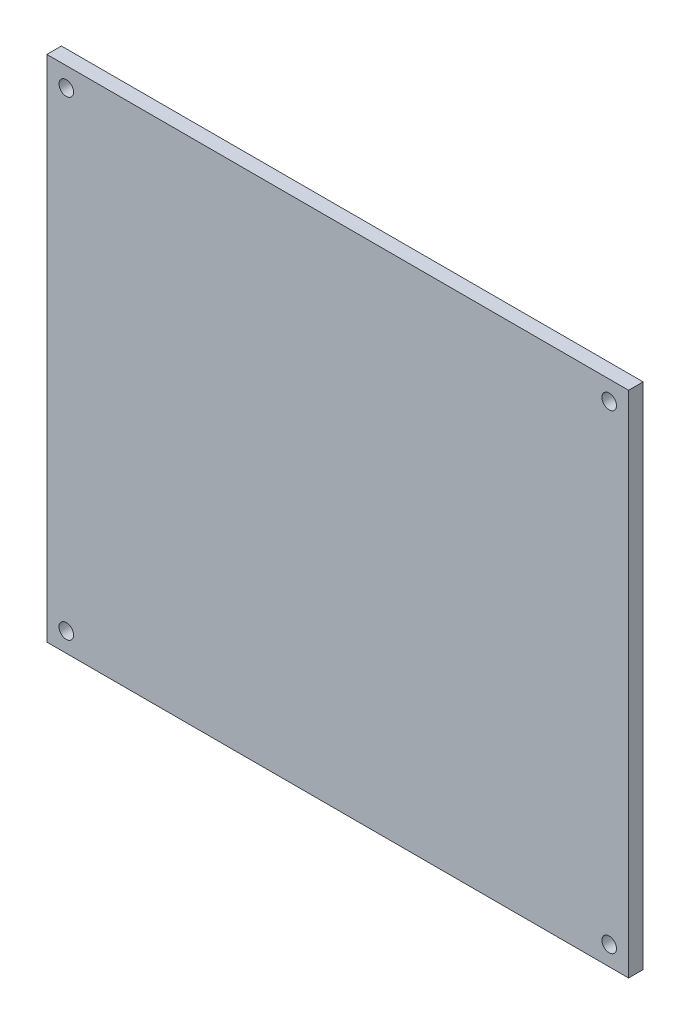
ISO-10303-21;
HEADER;
FILE_DESCRIPTION(('STEP AP214'),'2;1');
FILE_NAME('part.step','',(''),(''),'','','');
FILE_SCHEMA(('AUTOMOTIVE_DESIGN { 1 0 10303 214 1 1 1 1 }'));
ENDSEC;
DATA;
#1=APPLICATION_CONTEXT('core data for automotive mechanical design processes');
#2=APPLICATION_PROTOCOL_DEFINITION('international standard','automotive_design',2000,#1);
#3=PRODUCT_CONTEXT('',#1,'mechanical');
#4=PRODUCT('Part','Part','',(#3));
#5=PRODUCT_RELATED_PRODUCT_CATEGORY('part','',(#4));
#6=PRODUCT_DEFINITION_FORMATION('','',#4);
#7=PRODUCT_DEFINITION_CONTEXT('part definition',#1,'design');
#8=PRODUCT_DEFINITION('design','',#6,#7);
#9=PRODUCT_DEFINITION_SHAPE('','',#8);
#10=(LENGTH_UNIT() NAMED_UNIT(*) SI_UNIT(.MILLI.,.METRE.));
#11=(NAMED_UNIT(*) PLANE_ANGLE_UNIT() SI_UNIT($,.RADIAN.));
#12=(NAMED_UNIT(*) SI_UNIT($,.STERADIAN.) SOLID_ANGLE_UNIT());
#13=UNCERTAINTY_MEASURE_WITH_UNIT(LENGTH_MEASURE(1.E-05),#10,'distance_accuracy_value','');
#14=(GEOMETRIC_REPRESENTATION_CONTEXT(3) GLOBAL_UNCERTAINTY_ASSIGNED_CONTEXT((#13)) GLOBAL_UNIT_ASSIGNED_CONTEXT((#10,
#11,#12)) REPRESENTATION_CONTEXT('',''));
#15=CARTESIAN_POINT('',(0.,0.,0.));
#16=DIRECTION('',(0.,0.,1.));
#17=DIRECTION('',(1.,0.,0.));
#18=AXIS2_PLACEMENT_3D('',#15,#16,#17);
#19=CARTESIAN_POINT('',(60.,52.5,3.));
#20=DIRECTION('',(-1.,0.,0.));
#21=DIRECTION('',(0.,0.,1.));
#22=AXIS2_PLACEMENT_3D('',#19,#20,#21);
#23=PLANE('',#22);
#24=DIRECTION('',(0.,1.,0.));
#25=VECTOR('',#24,1.);
#26=CARTESIAN_POINT('',(60.,52.5,0.));
#27=LINE('',#26,#25);
#28=CARTESIAN_POINT('',(60.,-52.5,0.));
#29=VERTEX_POINT('',#28);
#30=CARTESIAN_POINT('',(60.,52.5,0.));
#31=VERTEX_POINT('',#30);
#32=EDGE_CURVE('E113',#29,#31,#27,.T.);
#33=ORIENTED_EDGE('',*,*,#32,.T.);
#34=DIRECTION('',(0.,0.,-1.));
#35=VECTOR('',#34,1.);
#36=CARTESIAN_POINT('',(60.,52.5,3.));
#37=LINE('',#36,#35);
#38=CARTESIAN_POINT('',(60.,52.5,3.));
#39=VERTEX_POINT('',#38);
#40=EDGE_CURVE('E11',#39,#31,#37,.T.);
#41=ORIENTED_EDGE('',*,*,#40,.F.);
#42=DIRECTION('',(0.,1.,0.));
#43=VECTOR('',#42,1.);
#44=CARTESIAN_POINT('',(60.,52.5,3.));
#45=LINE('',#44,#43);
#46=CARTESIAN_POINT('',(60.,-52.5,3.));
#47=VERTEX_POINT('',#46);
#48=EDGE_CURVE('E96',#47,#39,#45,.T.);
#49=ORIENTED_EDGE('',*,*,#48,.F.);
#50=DIRECTION('',(0.,0.,-1.));
#51=VECTOR('',#50,1.);
#52=CARTESIAN_POINT('',(60.,-52.5,3.));
#53=LINE('',#52,#51);
#54=EDGE_CURVE('E109',#47,#29,#53,.T.);
#55=ORIENTED_EDGE('',*,*,#54,.T.);
#56=EDGE_LOOP('',(#33,#41,#49,#55));
#57=FACE_BOUND('',#56,.T.);
#58=ADVANCED_FACE('F42',(#57),#23,.F.);
#59=CARTESIAN_POINT('',(-60.,52.5,3.));
#60=DIRECTION('',(0.,-1.,0.));
#61=DIRECTION('',(0.,0.,-1.));
#62=AXIS2_PLACEMENT_3D('',#59,#60,#61);
#63=PLANE('',#62);
#64=DIRECTION('',(-1.,0.,0.));
#65=VECTOR('',#64,1.);
#66=CARTESIAN_POINT('',(-60.,52.5,0.));
#67=LINE('',#66,#65);
#68=CARTESIAN_POINT('',(-60.,52.5,0.));
#69=VERTEX_POINT('',#68);
#70=EDGE_CURVE('E101',#31,#69,#67,.T.);
#71=ORIENTED_EDGE('',*,*,#70,.T.);
#72=DIRECTION('',(0.,0.,-1.));
#73=VECTOR('',#72,1.);
#74=CARTESIAN_POINT('',(-60.,52.5,3.));
#75=LINE('',#74,#73);
#76=CARTESIAN_POINT('',(-60.,52.5,3.));
#77=VERTEX_POINT('',#76);
#78=EDGE_CURVE('E52',#77,#69,#75,.T.);
#79=ORIENTED_EDGE('',*,*,#78,.F.);
#80=DIRECTION('',(-1.,0.,0.));
#81=VECTOR('',#80,1.);
#82=CARTESIAN_POINT('',(-60.,52.5,3.));
#83=LINE('',#82,#81);
#84=EDGE_CURVE('E91',#39,#77,#83,.T.);
#85=ORIENTED_EDGE('',*,*,#84,.F.);
#86=ORIENTED_EDGE('',*,*,#40,.T.);
#87=EDGE_LOOP('',(#71,#79,#85,#86));
#88=FACE_BOUND('',#87,.T.);
#89=ADVANCED_FACE('F100',(#88),#63,.F.);
#90=CARTESIAN_POINT('',(-60.,52.5,3.));
#91=DIRECTION('',(1.,0.,0.));
#92=DIRECTION('',(0.,0.,-1.));
#93=AXIS2_PLACEMENT_3D('',#90,#91,#92);
#94=PLANE('',#93);
#95=DIRECTION('',(0.,-1.,0.));
#96=VECTOR('',#95,1.);
#97=CARTESIAN_POINT('',(-60.,52.5,0.));
#98=LINE('',#97,#96);
#99=CARTESIAN_POINT('',(-60.,-52.5,0.));
#100=VERTEX_POINT('',#99);
#101=EDGE_CURVE('E78',#69,#100,#98,.T.);
#102=ORIENTED_EDGE('',*,*,#101,.T.);
#103=DIRECTION('',(0.,0.,-1.));
#104=VECTOR('',#103,1.);
#105=CARTESIAN_POINT('',(-60.,-52.5,3.));
#106=LINE('',#105,#104);
#107=CARTESIAN_POINT('',(-60.,-52.5,3.));
#108=VERTEX_POINT('',#107);
#109=EDGE_CURVE('E103',#108,#100,#106,.T.);
#110=ORIENTED_EDGE('',*,*,#109,.F.);
#111=DIRECTION('',(0.,-1.,0.));
#112=VECTOR('',#111,1.);
#113=CARTESIAN_POINT('',(-60.,52.5,3.));
#114=LINE('',#113,#112);
#115=EDGE_CURVE('E94',#77,#108,#114,.T.);
#116=ORIENTED_EDGE('',*,*,#115,.F.);
#117=ORIENTED_EDGE('',*,*,#78,.T.);
#118=EDGE_LOOP('',(#102,#110,#116,#117));
#119=FACE_BOUND('',#118,.T.);
#120=ADVANCED_FACE('F105',(#119),#94,.F.);
#121=CARTESIAN_POINT('',(-60.,-52.5,3.));
#122=DIRECTION('',(0.,1.,0.));
#123=DIRECTION('',(0.,0.,1.));
#124=AXIS2_PLACEMENT_3D('',#121,#122,#123);
#125=PLANE('',#124);
#126=DIRECTION('',(1.,0.,0.));
#127=VECTOR('',#126,1.);
#128=CARTESIAN_POINT('',(-60.,-52.5,0.));
#129=LINE('',#128,#127);
#130=EDGE_CURVE('E84',#100,#29,#129,.T.);
#131=ORIENTED_EDGE('',*,*,#130,.T.);
#132=ORIENTED_EDGE('',*,*,#54,.F.);
#133=DIRECTION('',(1.,0.,0.));
#134=VECTOR('',#133,1.);
#135=CARTESIAN_POINT('',(-60.,-52.5,3.));
#136=LINE('',#135,#134);
#137=EDGE_CURVE('E61',#108,#47,#136,.T.);
#138=ORIENTED_EDGE('',*,*,#137,.F.);
#139=ORIENTED_EDGE('',*,*,#109,.T.);
#140=EDGE_LOOP('',(#131,#132,#138,#139));
#141=FACE_BOUND('',#140,.T.);
#142=ADVANCED_FACE('F175',(#141),#125,.F.);
#143=CARTESIAN_POINT('',(0.,0.,3.));
#144=DIRECTION('',(0.,0.,1.));
#145=DIRECTION('',(1.,0.,0.));
#146=AXIS2_PLACEMENT_3D('',#143,#144,#145);
#147=PLANE('',#146);
#148=CARTESIAN_POINT('',(-56.,-48.5,3.));
#149=DIRECTION('',(0.,0.,1.));
#150=DIRECTION('',(-1.,0.,0.));
#151=AXIS2_PLACEMENT_3D('',#148,#149,#150);
#152=CIRCLE('',#151,1.5);
#153=CARTESIAN_POINT('',(-57.5,-48.5,3.));
#154=VERTEX_POINT('',#153);
#155=EDGE_CURVE('E276',#154,#154,#152,.T.);
#156=ORIENTED_EDGE('',*,*,#155,.F.);
#157=EDGE_LOOP('',(#156));
#158=FACE_BOUND('',#157,.T.);
#159=CARTESIAN_POINT('',(56.,-48.5,3.));
#160=DIRECTION('',(0.,0.,1.));
#161=DIRECTION('',(1.,0.,0.));
#162=AXIS2_PLACEMENT_3D('',#159,#160,#161);
#163=CIRCLE('',#162,1.49999999999999);
#164=CARTESIAN_POINT('',(57.5,-48.5,3.));
#165=VERTEX_POINT('',#164);
#166=EDGE_CURVE('E269',#165,#165,#163,.T.);
#167=ORIENTED_EDGE('',*,*,#166,.F.);
#168=EDGE_LOOP('',(#167));
#169=FACE_BOUND('',#168,.T.);
#170=CARTESIAN_POINT('',(56.,48.5,3.));
#171=DIRECTION('',(0.,0.,1.));
#172=DIRECTION('',(-1.,0.,0.));
#173=AXIS2_PLACEMENT_3D('',#170,#171,#172);
#174=CIRCLE('',#173,1.49999999999999);
#175=CARTESIAN_POINT('',(54.5,48.5,3.));
#176=VERTEX_POINT('',#175);
#177=EDGE_CURVE('E261',#176,#176,#174,.T.);
#178=ORIENTED_EDGE('',*,*,#177,.F.);
#179=EDGE_LOOP('',(#178));
#180=FACE_BOUND('',#179,.T.);
#181=CARTESIAN_POINT('',(-56.,48.5,3.));
#182=DIRECTION('',(0.,0.,1.));
#183=DIRECTION('',(1.,0.,0.));
#184=AXIS2_PLACEMENT_3D('',#181,#182,#183);
#185=CIRCLE('',#184,1.5);
#186=CARTESIAN_POINT('',(-54.5,48.5,3.));
#187=VERTEX_POINT('',#186);
#188=EDGE_CURVE('E132',#187,#187,#185,.T.);
#189=ORIENTED_EDGE('',*,*,#188,.F.);
#190=EDGE_LOOP('',(#189));
#191=FACE_BOUND('',#190,.T.);
#192=ORIENTED_EDGE('',*,*,#48,.T.);
#193=ORIENTED_EDGE('',*,*,#84,.T.);
#194=ORIENTED_EDGE('',*,*,#115,.T.);
#195=ORIENTED_EDGE('',*,*,#137,.T.);
#196=EDGE_LOOP('',(#192,#193,#194,#195));
#197=FACE_BOUND('',#196,.T.);
#198=ADVANCED_FACE('F92',(#158,#169,#180,#191,#197),#147,.T.);
#199=CARTESIAN_POINT('',(0.,0.,0.));
#200=DIRECTION('',(0.,0.,1.));
#201=DIRECTION('',(1.,0.,0.));
#202=AXIS2_PLACEMENT_3D('',#199,#200,#201);
#203=PLANE('',#202);
#204=CARTESIAN_POINT('',(-56.,-48.5,0.));
#205=DIRECTION('',(0.,0.,1.));
#206=DIRECTION('',(1.,0.,0.));
#207=AXIS2_PLACEMENT_3D('',#204,#205,#206);
#208=CIRCLE('',#207,1.5);
#209=CARTESIAN_POINT('',(-54.5,-48.5,0.));
#210=VERTEX_POINT('',#209);
#211=EDGE_CURVE('E45',#210,#210,#208,.T.);
#212=ORIENTED_EDGE('',*,*,#211,.T.);
#213=EDGE_LOOP('',(#212));
#214=FACE_BOUND('',#213,.T.);
#215=CARTESIAN_POINT('',(56.,-48.5,0.));
#216=DIRECTION('',(0.,0.,1.));
#217=DIRECTION('',(1.,0.,0.));
#218=AXIS2_PLACEMENT_3D('',#215,#216,#217);
#219=CIRCLE('',#218,1.49999999999999);
#220=CARTESIAN_POINT('',(57.5,-48.5,0.));
#221=VERTEX_POINT('',#220);
#222=EDGE_CURVE('E135',#221,#221,#219,.T.);
#223=ORIENTED_EDGE('',*,*,#222,.T.);
#224=EDGE_LOOP('',(#223));
#225=FACE_BOUND('',#224,.T.);
#226=CARTESIAN_POINT('',(56.,48.5,0.));
#227=DIRECTION('',(0.,0.,1.));
#228=DIRECTION('',(1.,0.,0.));
#229=AXIS2_PLACEMENT_3D('',#226,#227,#228);
#230=CIRCLE('',#229,1.49999999999999);
#231=CARTESIAN_POINT('',(57.5,48.5,0.));
#232=VERTEX_POINT('',#231);
#233=EDGE_CURVE('E131',#232,#232,#230,.T.);
#234=ORIENTED_EDGE('',*,*,#233,.T.);
#235=EDGE_LOOP('',(#234));
#236=FACE_BOUND('',#235,.T.);
#237=CARTESIAN_POINT('',(-56.,48.5,0.));
#238=DIRECTION('',(0.,0.,1.));
#239=DIRECTION('',(1.,0.,0.));
#240=AXIS2_PLACEMENT_3D('',#237,#238,#239);
#241=CIRCLE('',#240,1.5);
#242=CARTESIAN_POINT('',(-54.5,48.5,0.));
#243=VERTEX_POINT('',#242);
#244=EDGE_CURVE('E127',#243,#243,#241,.T.);
#245=ORIENTED_EDGE('',*,*,#244,.T.);
#246=EDGE_LOOP('',(#245));
#247=FACE_BOUND('',#246,.T.);
#248=ORIENTED_EDGE('',*,*,#32,.F.);
#249=ORIENTED_EDGE('',*,*,#130,.F.);
#250=ORIENTED_EDGE('',*,*,#101,.F.);
#251=ORIENTED_EDGE('',*,*,#70,.F.);
#252=EDGE_LOOP('',(#248,#249,#250,#251));
#253=FACE_BOUND('',#252,.T.);
#254=ADVANCED_FACE('F144',(#214,#225,#236,#247,#253),#203,.F.);
#255=CARTESIAN_POINT('',(-56.,48.5,-7.));
#256=DIRECTION('',(0.,0.,1.));
#257=DIRECTION('',(1.,0.,0.));
#258=AXIS2_PLACEMENT_3D('',#255,#256,#257);
#259=CYLINDRICAL_SURFACE('',#258,1.5);
#260=ORIENTED_EDGE('',*,*,#188,.T.);
#261=EDGE_LOOP('',(#260));
#262=FACE_BOUND('',#261,.T.);
#263=ORIENTED_EDGE('',*,*,#244,.F.);
#264=EDGE_LOOP('',(#263));
#265=FACE_BOUND('',#264,.T.);
#266=ADVANCED_FACE('F167',(#262,#265),#259,.F.);
#267=CARTESIAN_POINT('',(56.,48.5,-7.));
#268=DIRECTION('',(0.,0.,1.));
#269=DIRECTION('',(1.,0.,0.));
#270=AXIS2_PLACEMENT_3D('',#267,#268,#269);
#271=CYLINDRICAL_SURFACE('',#270,1.49999999999999);
#272=ORIENTED_EDGE('',*,*,#177,.T.);
#273=EDGE_LOOP('',(#272));
#274=FACE_BOUND('',#273,.T.);
#275=ORIENTED_EDGE('',*,*,#233,.F.);
#276=EDGE_LOOP('',(#275));
#277=FACE_BOUND('',#276,.T.);
#278=ADVANCED_FACE('F154',(#274,#277),#271,.F.);
#279=CARTESIAN_POINT('',(56.,-48.5,-7.));
#280=DIRECTION('',(0.,0.,1.));
#281=DIRECTION('',(1.,0.,0.));
#282=AXIS2_PLACEMENT_3D('',#279,#280,#281);
#283=CYLINDRICAL_SURFACE('',#282,1.49999999999999);
#284=ORIENTED_EDGE('',*,*,#166,.T.);
#285=EDGE_LOOP('',(#284));
#286=FACE_BOUND('',#285,.T.);
#287=ORIENTED_EDGE('',*,*,#222,.F.);
#288=EDGE_LOOP('',(#287));
#289=FACE_BOUND('',#288,.T.);
#290=ADVANCED_FACE('F148',(#286,#289),#283,.F.);
#291=CARTESIAN_POINT('',(-56.,-48.5,-7.));
#292=DIRECTION('',(0.,0.,1.));
#293=DIRECTION('',(1.,0.,0.));
#294=AXIS2_PLACEMENT_3D('',#291,#292,#293);
#295=CYLINDRICAL_SURFACE('',#294,1.5);
#296=ORIENTED_EDGE('',*,*,#155,.T.);
#297=EDGE_LOOP('',(#296));
#298=FACE_BOUND('',#297,.T.);
#299=ORIENTED_EDGE('',*,*,#211,.F.);
#300=EDGE_LOOP('',(#299));
#301=FACE_BOUND('',#300,.T.);
#302=ADVANCED_FACE('F146',(#298,#301),#295,.F.);
#303=CLOSED_SHELL('',(#58,#89,#120,#142,#198,#254,#266,#278,#290,#302));
#304=MANIFOLD_SOLID_BREP('B2',#303);
#305=ADVANCED_BREP_SHAPE_REPRESENTATION('',(#18,#304),#14);
#306=SHAPE_DEFINITION_REPRESENTATION(#9,#305);
ENDSEC;
END-ISO-10303-21;
